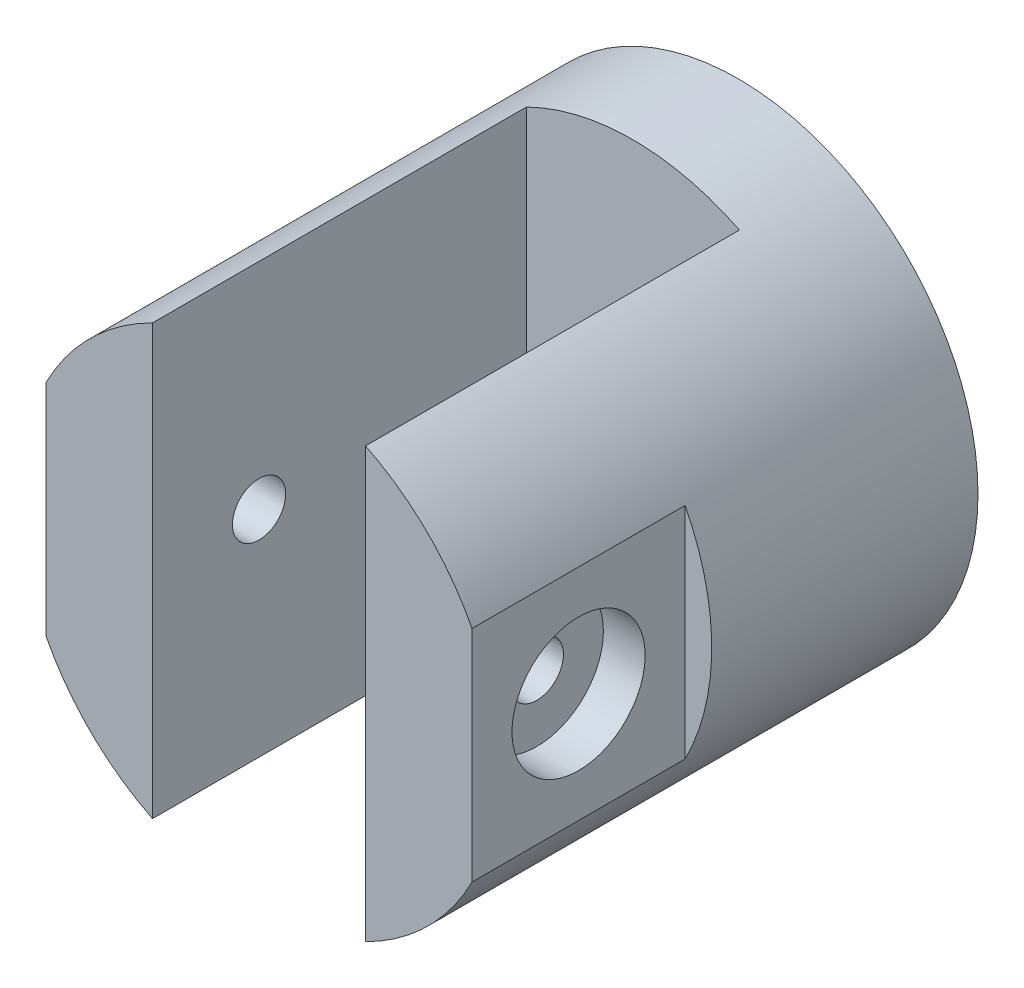
ISO-10303-21;
HEADER;
FILE_DESCRIPTION(('STEP AP214'),'2;1');
FILE_NAME('part.step','',(''),(''),'','','');
FILE_SCHEMA(('AUTOMOTIVE_DESIGN { 1 0 10303 214 1 1 1 1 }'));
ENDSEC;
DATA;
#1=APPLICATION_CONTEXT('core data for automotive mechanical design processes');
#2=APPLICATION_PROTOCOL_DEFINITION('international standard','automotive_design',2000,#1);
#3=PRODUCT_CONTEXT('',#1,'mechanical');
#4=PRODUCT('Part','Part','',(#3));
#5=PRODUCT_RELATED_PRODUCT_CATEGORY('part','',(#4));
#6=PRODUCT_DEFINITION_FORMATION('','',#4);
#7=PRODUCT_DEFINITION_CONTEXT('part definition',#1,'design');
#8=PRODUCT_DEFINITION('design','',#6,#7);
#9=PRODUCT_DEFINITION_SHAPE('','',#8);
#10=(LENGTH_UNIT() NAMED_UNIT(*) SI_UNIT(.MILLI.,.METRE.));
#11=(NAMED_UNIT(*) PLANE_ANGLE_UNIT() SI_UNIT($,.RADIAN.));
#12=(NAMED_UNIT(*) SI_UNIT($,.STERADIAN.) SOLID_ANGLE_UNIT());
#13=UNCERTAINTY_MEASURE_WITH_UNIT(LENGTH_MEASURE(1.E-05),#10,'distance_accuracy_value','');
#14=(GEOMETRIC_REPRESENTATION_CONTEXT(3) GLOBAL_UNCERTAINTY_ASSIGNED_CONTEXT((#13)) GLOBAL_UNIT_ASSIGNED_CONTEXT((#10,
#11,#12)) REPRESENTATION_CONTEXT('',''));
#15=CARTESIAN_POINT('',(0.,0.,0.));
#16=DIRECTION('',(0.,0.,1.));
#17=DIRECTION('',(1.,0.,0.));
#18=AXIS2_PLACEMENT_3D('',#15,#16,#17);
#19=CARTESIAN_POINT('',(-28.575,0.,44.45));
#20=DIRECTION('',(1.,0.,0.));
#21=DIRECTION('',(0.,0.,-1.));
#22=AXIS2_PLACEMENT_3D('',#19,#20,#21);
#23=CYLINDRICAL_SURFACE('',#22,3.175);
#24=CARTESIAN_POINT('',(-12.7,0.,44.45));
#25=DIRECTION('',(-1.,0.,0.));
#26=DIRECTION('',(0.,0.,1.));
#27=AXIS2_PLACEMENT_3D('',#24,#25,#26);
#28=CIRCLE('',#27,3.175);
#29=CARTESIAN_POINT('',(-12.7,0.,47.625));
#30=VERTEX_POINT('',#29);
#31=EDGE_CURVE('E139',#30,#30,#28,.T.);
#32=ORIENTED_EDGE('',*,*,#31,.F.);
#33=EDGE_LOOP('',(#32));
#34=FACE_BOUND('',#33,.T.);
#35=CARTESIAN_POINT('',(-20.4216,0.,44.45));
#36=DIRECTION('',(-1.,0.,0.));
#37=DIRECTION('',(0.,-1.,0.));
#38=AXIS2_PLACEMENT_3D('',#35,#36,#37);
#39=CIRCLE('',#38,3.175);
#40=CARTESIAN_POINT('',(-20.4216,-3.175,44.45));
#41=VERTEX_POINT('',#40);
#42=EDGE_CURVE('E43',#41,#41,#39,.F.);
#43=ORIENTED_EDGE('',*,*,#42,.F.);
#44=EDGE_LOOP('',(#43));
#45=FACE_BOUND('',#44,.T.);
#46=ADVANCED_FACE('F39',(#34,#45),#23,.F.);
#47=CARTESIAN_POINT('',(0.,0.,57.15));
#48=DIRECTION('',(0.,0.,-1.));
#49=DIRECTION('',(-1.,0.,0.));
#50=AXIS2_PLACEMENT_3D('',#47,#48,#49);
#51=CYLINDRICAL_SURFACE('',#50,28.575);
#52=CARTESIAN_POINT('',(0.,0.,0.));
#53=DIRECTION('',(0.,0.,1.));
#54=DIRECTION('',(1.,0.,0.));
#55=AXIS2_PLACEMENT_3D('',#52,#53,#54);
#56=CIRCLE('',#55,28.575);
#57=CARTESIAN_POINT('',(28.575,0.,0.));
#58=VERTEX_POINT('',#57);
#59=EDGE_CURVE('E185',#58,#58,#56,.T.);
#60=ORIENTED_EDGE('',*,*,#59,.T.);
#61=EDGE_LOOP('',(#60));
#62=FACE_BOUND('',#61,.T.);
#63=DIRECTION('',(0.,0.,-1.));
#64=VECTOR('',#63,1.);
#65=CARTESIAN_POINT('',(-25.4,13.0908603613361,200.727129565702));
#66=LINE('',#65,#64);
#67=CARTESIAN_POINT('',(-25.4,13.0908603613361,57.15));
#68=VERTEX_POINT('',#67);
#69=CARTESIAN_POINT('',(-25.4,13.0908603613361,31.75));
#70=VERTEX_POINT('',#69);
#71=EDGE_CURVE('E111',#68,#70,#66,.T.);
#72=ORIENTED_EDGE('',*,*,#71,.F.);
#73=CARTESIAN_POINT('',(0.,0.,57.15));
#74=DIRECTION('',(0.,0.,1.));
#75=DIRECTION('',(1.,0.,0.));
#76=AXIS2_PLACEMENT_3D('',#73,#74,#75);
#77=CIRCLE('',#76,28.575);
#78=CARTESIAN_POINT('',(-12.7,25.5976683508479,57.15));
#79=VERTEX_POINT('',#78);
#80=EDGE_CURVE('E192',#79,#68,#77,.T.);
#81=ORIENTED_EDGE('',*,*,#80,.F.);
#82=DIRECTION('',(0.,0.,-1.));
#83=VECTOR('',#82,1.);
#84=CARTESIAN_POINT('',(-12.7,25.5976683508479,57.15));
#85=LINE('',#84,#83);
#86=CARTESIAN_POINT('',(-12.7,25.5976683508479,12.573));
#87=VERTEX_POINT('',#86);
#88=EDGE_CURVE('E176',#79,#87,#85,.T.);
#89=ORIENTED_EDGE('',*,*,#88,.T.);
#90=CARTESIAN_POINT('',(0.,0.,12.573));
#91=DIRECTION('',(0.,0.,-1.));
#92=DIRECTION('',(-1.,0.,0.));
#93=AXIS2_PLACEMENT_3D('',#90,#91,#92);
#94=CIRCLE('',#93,28.575);
#95=CARTESIAN_POINT('',(12.7,25.5976683508479,12.573));
#96=VERTEX_POINT('',#95);
#97=EDGE_CURVE('E208',#87,#96,#94,.T.);
#98=ORIENTED_EDGE('',*,*,#97,.T.);
#99=DIRECTION('',(0.,0.,-1.));
#100=VECTOR('',#99,1.);
#101=CARTESIAN_POINT('',(12.7,25.5976683508479,57.15));
#102=LINE('',#101,#100);
#103=CARTESIAN_POINT('',(12.7,25.5976683508479,57.15));
#104=VERTEX_POINT('',#103);
#105=EDGE_CURVE('E179',#96,#104,#102,.F.);
#106=ORIENTED_EDGE('',*,*,#105,.T.);
#107=CARTESIAN_POINT('',(25.4,13.0908603613361,57.15));
#108=VERTEX_POINT('',#107);
#109=EDGE_CURVE('E191',#108,#104,#77,.T.);
#110=ORIENTED_EDGE('',*,*,#109,.F.);
#111=DIRECTION('',(0.,0.,-1.));
#112=VECTOR('',#111,1.);
#113=CARTESIAN_POINT('',(25.4,13.0908603613361,57.15));
#114=LINE('',#113,#112);
#115=CARTESIAN_POINT('',(25.4,13.0908603613361,31.75));
#116=VERTEX_POINT('',#115);
#117=EDGE_CURVE('E49',#116,#108,#114,.F.);
#118=ORIENTED_EDGE('',*,*,#117,.F.);
#119=CARTESIAN_POINT('',(0.,0.,31.75));
#120=DIRECTION('',(0.,0.,1.));
#121=DIRECTION('',(1.,0.,0.));
#122=AXIS2_PLACEMENT_3D('',#119,#120,#121);
#123=CIRCLE('',#122,28.575);
#124=CARTESIAN_POINT('',(25.4,-13.0908603613361,31.75));
#125=VERTEX_POINT('',#124);
#126=EDGE_CURVE('E150',#125,#116,#123,.T.);
#127=ORIENTED_EDGE('',*,*,#126,.F.);
#128=DIRECTION('',(0.,0.,-1.));
#129=VECTOR('',#128,1.);
#130=CARTESIAN_POINT('',(25.4,-13.0908603613361,57.15));
#131=LINE('',#130,#129);
#132=CARTESIAN_POINT('',(25.4,-13.0908603613361,57.15));
#133=VERTEX_POINT('',#132);
#134=EDGE_CURVE('E12',#133,#125,#131,.T.);
#135=ORIENTED_EDGE('',*,*,#134,.F.);
#136=CARTESIAN_POINT('',(12.7,-25.5976683508479,57.15));
#137=VERTEX_POINT('',#136);
#138=EDGE_CURVE('E186',#137,#133,#77,.T.);
#139=ORIENTED_EDGE('',*,*,#138,.F.);
#140=DIRECTION('',(0.,0.,-1.));
#141=VECTOR('',#140,1.);
#142=CARTESIAN_POINT('',(12.7,-25.5976683508479,57.15));
#143=LINE('',#142,#141);
#144=CARTESIAN_POINT('',(12.7,-25.5976683508479,12.573));
#145=VERTEX_POINT('',#144);
#146=EDGE_CURVE('E182',#137,#145,#143,.T.);
#147=ORIENTED_EDGE('',*,*,#146,.T.);
#148=CARTESIAN_POINT('',(-12.7,-25.5976683508479,12.573));
#149=VERTEX_POINT('',#148);
#150=EDGE_CURVE('E204',#145,#149,#94,.T.);
#151=ORIENTED_EDGE('',*,*,#150,.T.);
#152=DIRECTION('',(0.,0.,-1.));
#153=VECTOR('',#152,1.);
#154=CARTESIAN_POINT('',(-12.7,-25.5976683508479,57.15));
#155=LINE('',#154,#153);
#156=CARTESIAN_POINT('',(-12.7,-25.5976683508479,57.15));
#157=VERTEX_POINT('',#156);
#158=EDGE_CURVE('E169',#149,#157,#155,.F.);
#159=ORIENTED_EDGE('',*,*,#158,.T.);
#160=CARTESIAN_POINT('',(-25.4,-13.0908603613361,57.15));
#161=VERTEX_POINT('',#160);
#162=EDGE_CURVE('E190',#161,#157,#77,.T.);
#163=ORIENTED_EDGE('',*,*,#162,.F.);
#164=DIRECTION('',(0.,0.,-1.));
#165=VECTOR('',#164,1.);
#166=CARTESIAN_POINT('',(-25.4,-13.0908603613361,200.727129565702));
#167=LINE('',#166,#165);
#168=CARTESIAN_POINT('',(-25.4,-13.0908603613361,31.75));
#169=VERTEX_POINT('',#168);
#170=EDGE_CURVE('E57',#161,#169,#167,.T.);
#171=ORIENTED_EDGE('',*,*,#170,.T.);
#172=CARTESIAN_POINT('',(0.,0.,31.75));
#173=DIRECTION('',(0.,0.,1.));
#174=DIRECTION('',(1.,0.,0.));
#175=AXIS2_PLACEMENT_3D('',#172,#173,#174);
#176=CIRCLE('',#175,28.575);
#177=EDGE_CURVE('E109',#70,#169,#176,.T.);
#178=ORIENTED_EDGE('',*,*,#177,.F.);
#179=EDGE_LOOP('',(#72,#81,#89,#98,#106,#110,#118,#127,#135,#139,#147,#151,#159,#163,#171,#178));
#180=FACE_BOUND('',#179,.T.);
#181=ADVANCED_FACE('F41',(#62,#180),#51,.T.);
#182=CARTESIAN_POINT('',(0.,0.,57.15));
#183=DIRECTION('',(0.,0.,1.));
#184=DIRECTION('',(1.,0.,0.));
#185=AXIS2_PLACEMENT_3D('',#182,#183,#184);
#186=PLANE('',#185);
#187=ORIENTED_EDGE('',*,*,#80,.T.);
#188=DIRECTION('',(0.,1.,0.));
#189=VECTOR('',#188,1.);
#190=CARTESIAN_POINT('',(-25.4,-13.0908603613361,57.15));
#191=LINE('',#190,#189);
#192=EDGE_CURVE('E115',#161,#68,#191,.T.);
#193=ORIENTED_EDGE('',*,*,#192,.F.);
#194=ORIENTED_EDGE('',*,*,#162,.T.);
#195=DIRECTION('',(0.,-1.,0.));
#196=VECTOR('',#195,1.);
#197=CARTESIAN_POINT('',(-12.7,0.,57.15));
#198=LINE('',#197,#196);
#199=EDGE_CURVE('E196',#79,#157,#198,.T.);
#200=ORIENTED_EDGE('',*,*,#199,.F.);
#201=EDGE_LOOP('',(#187,#193,#194,#200));
#202=FACE_BOUND('',#201,.T.);
#203=ADVANCED_FACE('F219',(#202),#186,.T.);
#204=CARTESIAN_POINT('',(12.7,0.,44.45));
#205=DIRECTION('',(1.,0.,0.));
#206=DIRECTION('',(0.,0.,-1.));
#207=AXIS2_PLACEMENT_3D('',#204,#205,#206);
#208=CIRCLE('',#207,3.175);
#209=CARTESIAN_POINT('',(12.7,0.,41.275));
#210=VERTEX_POINT('',#209);
#211=EDGE_CURVE('E143',#210,#210,#208,.T.);
#212=ORIENTED_EDGE('',*,*,#211,.F.);
#213=EDGE_LOOP('',(#212));
#214=FACE_BOUND('',#213,.T.);
#215=CARTESIAN_POINT('',(20.4216,0.,44.45));
#216=DIRECTION('',(1.,0.,0.));
#217=DIRECTION('',(0.,0.,-1.));
#218=AXIS2_PLACEMENT_3D('',#215,#216,#217);
#219=CIRCLE('',#218,3.175);
#220=CARTESIAN_POINT('',(20.4216,0.,41.275));
#221=VERTEX_POINT('',#220);
#222=EDGE_CURVE('E134',#221,#221,#219,.F.);
#223=ORIENTED_EDGE('',*,*,#222,.F.);
#224=EDGE_LOOP('',(#223));
#225=FACE_BOUND('',#224,.T.);
#226=ADVANCED_FACE('F216',(#214,#225),#23,.F.);
#227=ORIENTED_EDGE('',*,*,#138,.T.);
#228=DIRECTION('',(0.,1.,0.));
#229=VECTOR('',#228,1.);
#230=CARTESIAN_POINT('',(25.4,-25.5976683508479,57.15));
#231=LINE('',#230,#229);
#232=EDGE_CURVE('E147',#133,#108,#231,.T.);
#233=ORIENTED_EDGE('',*,*,#232,.T.);
#234=ORIENTED_EDGE('',*,*,#109,.T.);
#235=DIRECTION('',(0.,1.,0.));
#236=VECTOR('',#235,1.);
#237=CARTESIAN_POINT('',(12.7,0.,57.15));
#238=LINE('',#237,#236);
#239=EDGE_CURVE('E200',#137,#104,#238,.T.);
#240=ORIENTED_EDGE('',*,*,#239,.F.);
#241=EDGE_LOOP('',(#227,#233,#234,#240));
#242=FACE_BOUND('',#241,.T.);
#243=ADVANCED_FACE('F218',(#242),#186,.T.);
#244=CARTESIAN_POINT('',(0.,0.,0.));
#245=DIRECTION('',(0.,0.,1.));
#246=DIRECTION('',(1.,0.,0.));
#247=AXIS2_PLACEMENT_3D('',#244,#245,#246);
#248=PLANE('',#247);
#249=CARTESIAN_POINT('',(0.,0.,0.));
#250=DIRECTION('',(0.,0.,1.));
#251=DIRECTION('',(1.,0.,0.));
#252=AXIS2_PLACEMENT_3D('',#249,#250,#251);
#253=CIRCLE('',#252,7.9375);
#254=CARTESIAN_POINT('',(7.9375,0.,0.));
#255=VERTEX_POINT('',#254);
#256=EDGE_CURVE('E157',#255,#255,#253,.T.);
#257=ORIENTED_EDGE('',*,*,#256,.T.);
#258=EDGE_LOOP('',(#257));
#259=FACE_BOUND('',#258,.T.);
#260=ORIENTED_EDGE('',*,*,#59,.F.);
#261=EDGE_LOOP('',(#260));
#262=FACE_BOUND('',#261,.T.);
#263=ADVANCED_FACE('F227',(#259,#262),#248,.F.);
#264=CARTESIAN_POINT('',(-12.7,-50.8,12.573));
#265=DIRECTION('',(0.,0.,-1.));
#266=DIRECTION('',(-1.,0.,0.));
#267=AXIS2_PLACEMENT_3D('',#264,#265,#266);
#268=PLANE('',#267);
#269=CARTESIAN_POINT('',(0.,0.,12.573));
#270=DIRECTION('',(0.,0.,1.));
#271=DIRECTION('',(1.,0.,0.));
#272=AXIS2_PLACEMENT_3D('',#269,#270,#271);
#273=CIRCLE('',#272,7.9375);
#274=CARTESIAN_POINT('',(7.9375,0.,12.573));
#275=VERTEX_POINT('',#274);
#276=EDGE_CURVE('E156',#275,#275,#273,.T.);
#277=ORIENTED_EDGE('',*,*,#276,.F.);
#278=EDGE_LOOP('',(#277));
#279=FACE_BOUND('',#278,.T.);
#280=DIRECTION('',(0.,1.,0.));
#281=VECTOR('',#280,1.);
#282=CARTESIAN_POINT('',(-12.7,-50.8,12.573));
#283=LINE('',#282,#281);
#284=EDGE_CURVE('E165',#149,#87,#283,.T.);
#285=ORIENTED_EDGE('',*,*,#284,.F.);
#286=ORIENTED_EDGE('',*,*,#150,.F.);
#287=DIRECTION('',(0.,1.,0.));
#288=VECTOR('',#287,1.);
#289=CARTESIAN_POINT('',(12.7,-50.8,12.573));
#290=LINE('',#289,#288);
#291=EDGE_CURVE('E161',#145,#96,#290,.T.);
#292=ORIENTED_EDGE('',*,*,#291,.T.);
#293=ORIENTED_EDGE('',*,*,#97,.F.);
#294=EDGE_LOOP('',(#285,#286,#292,#293));
#295=FACE_BOUND('',#294,.T.);
#296=ADVANCED_FACE('F290',(#279,#295),#268,.F.);
#297=CARTESIAN_POINT('',(12.7,-50.8,12.573));
#298=DIRECTION('',(1.,0.,0.));
#299=DIRECTION('',(0.,0.,-1.));
#300=AXIS2_PLACEMENT_3D('',#297,#298,#299);
#301=PLANE('',#300);
#302=ORIENTED_EDGE('',*,*,#211,.T.);
#303=EDGE_LOOP('',(#302));
#304=FACE_BOUND('',#303,.T.);
#305=ORIENTED_EDGE('',*,*,#239,.T.);
#306=ORIENTED_EDGE('',*,*,#105,.F.);
#307=ORIENTED_EDGE('',*,*,#291,.F.);
#308=ORIENTED_EDGE('',*,*,#146,.F.);
#309=EDGE_LOOP('',(#305,#306,#307,#308));
#310=FACE_BOUND('',#309,.T.);
#311=ADVANCED_FACE('F293',(#304,#310),#301,.F.);
#312=CARTESIAN_POINT('',(-12.7,-50.8,12.573));
#313=DIRECTION('',(-1.,0.,0.));
#314=DIRECTION('',(0.,0.,1.));
#315=AXIS2_PLACEMENT_3D('',#312,#313,#314);
#316=PLANE('',#315);
#317=ORIENTED_EDGE('',*,*,#31,.T.);
#318=EDGE_LOOP('',(#317));
#319=FACE_BOUND('',#318,.T.);
#320=ORIENTED_EDGE('',*,*,#199,.T.);
#321=ORIENTED_EDGE('',*,*,#158,.F.);
#322=ORIENTED_EDGE('',*,*,#284,.T.);
#323=ORIENTED_EDGE('',*,*,#88,.F.);
#324=EDGE_LOOP('',(#320,#321,#322,#323));
#325=FACE_BOUND('',#324,.T.);
#326=ADVANCED_FACE('F300',(#319,#325),#316,.F.);
#327=CARTESIAN_POINT('',(0.,0.,0.));
#328=DIRECTION('',(0.,0.,1.));
#329=DIRECTION('',(1.,0.,0.));
#330=AXIS2_PLACEMENT_3D('',#327,#328,#329);
#331=CYLINDRICAL_SURFACE('',#330,7.9375);
#332=ORIENTED_EDGE('',*,*,#256,.F.);
#333=EDGE_LOOP('',(#332));
#334=FACE_BOUND('',#333,.T.);
#335=ORIENTED_EDGE('',*,*,#276,.T.);
#336=EDGE_LOOP('',(#335));
#337=FACE_BOUND('',#336,.T.);
#338=ADVANCED_FACE('F276',(#334,#337),#331,.F.);
#339=CARTESIAN_POINT('',(25.4,-25.5976683508479,31.75));
#340=DIRECTION('',(1.,0.,0.));
#341=DIRECTION('',(0.,0.,-1.));
#342=AXIS2_PLACEMENT_3D('',#339,#340,#341);
#343=PLANE('',#342);
#344=CARTESIAN_POINT('',(25.4,0.,44.45));
#345=DIRECTION('',(1.,0.,0.));
#346=DIRECTION('',(0.,0.,-1.));
#347=AXIS2_PLACEMENT_3D('',#344,#345,#346);
#348=CIRCLE('',#347,7.9375);
#349=CARTESIAN_POINT('',(25.4,0.,36.5125));
#350=VERTEX_POINT('',#349);
#351=EDGE_CURVE('E135',#350,#350,#348,.T.);
#352=ORIENTED_EDGE('',*,*,#351,.F.);
#353=EDGE_LOOP('',(#352));
#354=FACE_BOUND('',#353,.T.);
#355=ORIENTED_EDGE('',*,*,#134,.T.);
#356=DIRECTION('',(0.,1.,0.));
#357=VECTOR('',#356,1.);
#358=CARTESIAN_POINT('',(25.4,-25.5976683508479,31.75));
#359=LINE('',#358,#357);
#360=EDGE_CURVE('E64',#125,#116,#359,.T.);
#361=ORIENTED_EDGE('',*,*,#360,.T.);
#362=ORIENTED_EDGE('',*,*,#117,.T.);
#363=ORIENTED_EDGE('',*,*,#232,.F.);
#364=EDGE_LOOP('',(#355,#361,#362,#363));
#365=FACE_BOUND('',#364,.T.);
#366=ADVANCED_FACE('F275',(#354,#365),#343,.T.);
#367=CARTESIAN_POINT('',(0.,0.,31.75));
#368=DIRECTION('',(0.,0.,1.));
#369=DIRECTION('',(1.,0.,0.));
#370=AXIS2_PLACEMENT_3D('',#367,#368,#369);
#371=PLANE('',#370);
#372=ORIENTED_EDGE('',*,*,#126,.T.);
#373=ORIENTED_EDGE('',*,*,#360,.F.);
#374=EDGE_LOOP('',(#372,#373));
#375=FACE_BOUND('',#374,.T.);
#376=ADVANCED_FACE('F265',(#375),#371,.T.);
#377=CARTESIAN_POINT('',(20.4216,0.,44.45));
#378=DIRECTION('',(1.,0.,0.));
#379=DIRECTION('',(0.,0.,-1.));
#380=AXIS2_PLACEMENT_3D('',#377,#378,#379);
#381=PLANE('',#380);
#382=CARTESIAN_POINT('',(20.4216,0.,44.45));
#383=DIRECTION('',(1.,0.,0.));
#384=DIRECTION('',(0.,0.,-1.));
#385=AXIS2_PLACEMENT_3D('',#382,#383,#384);
#386=CIRCLE('',#385,7.9375);
#387=CARTESIAN_POINT('',(20.4216,0.,36.5125));
#388=VERTEX_POINT('',#387);
#389=EDGE_CURVE('E130',#388,#388,#386,.T.);
#390=ORIENTED_EDGE('',*,*,#389,.T.);
#391=EDGE_LOOP('',(#390));
#392=FACE_BOUND('',#391,.T.);
#393=ORIENTED_EDGE('',*,*,#222,.T.);
#394=EDGE_LOOP('',(#393));
#395=FACE_BOUND('',#394,.T.);
#396=ADVANCED_FACE('F214',(#392,#395),#381,.T.);
#397=CARTESIAN_POINT('',(20.4216,0.,44.45));
#398=DIRECTION('',(1.,0.,0.));
#399=DIRECTION('',(0.,0.,-1.));
#400=AXIS2_PLACEMENT_3D('',#397,#398,#399);
#401=CYLINDRICAL_SURFACE('',#400,7.9375);
#402=ORIENTED_EDGE('',*,*,#389,.F.);
#403=EDGE_LOOP('',(#402));
#404=FACE_BOUND('',#403,.T.);
#405=ORIENTED_EDGE('',*,*,#351,.T.);
#406=EDGE_LOOP('',(#405));
#407=FACE_BOUND('',#406,.T.);
#408=ADVANCED_FACE('F261',(#404,#407),#401,.F.);
#409=CARTESIAN_POINT('',(-25.4,-13.0908603613361,200.727129565702));
#410=DIRECTION('',(-1.,0.,0.));
#411=DIRECTION('',(0.,-1.,0.));
#412=AXIS2_PLACEMENT_3D('',#409,#410,#411);
#413=PLANE('',#412);
#414=CARTESIAN_POINT('',(-25.4,0.,44.45));
#415=DIRECTION('',(-1.,0.,0.));
#416=DIRECTION('',(0.,-1.,0.));
#417=AXIS2_PLACEMENT_3D('',#414,#415,#416);
#418=CIRCLE('',#417,7.9375);
#419=CARTESIAN_POINT('',(-25.4,-7.9375,44.45));
#420=VERTEX_POINT('',#419);
#421=EDGE_CURVE('E423',#420,#420,#418,.T.);
#422=ORIENTED_EDGE('',*,*,#421,.F.);
#423=EDGE_LOOP('',(#422));
#424=FACE_BOUND('',#423,.T.);
#425=ORIENTED_EDGE('',*,*,#170,.F.);
#426=ORIENTED_EDGE('',*,*,#192,.T.);
#427=ORIENTED_EDGE('',*,*,#71,.T.);
#428=DIRECTION('',(0.,1.,0.));
#429=VECTOR('',#428,1.);
#430=CARTESIAN_POINT('',(-25.4,-13.0908603613361,31.75));
#431=LINE('',#430,#429);
#432=EDGE_CURVE('E105',#169,#70,#431,.T.);
#433=ORIENTED_EDGE('',*,*,#432,.F.);
#434=EDGE_LOOP('',(#425,#426,#427,#433));
#435=FACE_BOUND('',#434,.T.);
#436=ADVANCED_FACE('F114',(#424,#435),#413,.T.);
#437=CARTESIAN_POINT('',(0.,0.,31.75));
#438=DIRECTION('',(0.,0.,1.));
#439=DIRECTION('',(1.,0.,0.));
#440=AXIS2_PLACEMENT_3D('',#437,#438,#439);
#441=PLANE('',#440);
#442=ORIENTED_EDGE('',*,*,#432,.T.);
#443=ORIENTED_EDGE('',*,*,#177,.T.);
#444=EDGE_LOOP('',(#442,#443));
#445=FACE_BOUND('',#444,.T.);
#446=ADVANCED_FACE('F107',(#445),#441,.T.);
#447=CARTESIAN_POINT('',(-20.4216,0.,44.45));
#448=DIRECTION('',(-1.,0.,0.));
#449=DIRECTION('',(0.,-1.,0.));
#450=AXIS2_PLACEMENT_3D('',#447,#448,#449);
#451=PLANE('',#450);
#452=CARTESIAN_POINT('',(-20.4216,0.,44.45));
#453=DIRECTION('',(-1.,0.,0.));
#454=DIRECTION('',(0.,-1.,0.));
#455=AXIS2_PLACEMENT_3D('',#452,#453,#454);
#456=CIRCLE('',#455,7.9375);
#457=CARTESIAN_POINT('',(-20.4216,-7.9375,44.45));
#458=VERTEX_POINT('',#457);
#459=EDGE_CURVE('E126',#458,#458,#456,.T.);
#460=ORIENTED_EDGE('',*,*,#459,.T.);
#461=EDGE_LOOP('',(#460));
#462=FACE_BOUND('',#461,.T.);
#463=ORIENTED_EDGE('',*,*,#42,.T.);
#464=EDGE_LOOP('',(#463));
#465=FACE_BOUND('',#464,.T.);
#466=ADVANCED_FACE('F247',(#462,#465),#451,.T.);
#467=CARTESIAN_POINT('',(-20.4216,0.,44.45));
#468=DIRECTION('',(-1.,0.,0.));
#469=DIRECTION('',(0.,-1.,0.));
#470=AXIS2_PLACEMENT_3D('',#467,#468,#469);
#471=CYLINDRICAL_SURFACE('',#470,7.9375);
#472=ORIENTED_EDGE('',*,*,#459,.F.);
#473=EDGE_LOOP('',(#472));
#474=FACE_BOUND('',#473,.T.);
#475=ORIENTED_EDGE('',*,*,#421,.T.);
#476=EDGE_LOOP('',(#475));
#477=FACE_BOUND('',#476,.T.);
#478=ADVANCED_FACE('F249',(#474,#477),#471,.F.);
#479=CLOSED_SHELL('',(#46,#181,#203,#226,#243,#263,#296,#311,#326,#338,#366,#376,#396,#408,#436,
#446,#466,#478));
#480=MANIFOLD_SOLID_BREP('B2',#479);
#481=ADVANCED_BREP_SHAPE_REPRESENTATION('',(#18,#480),#14);
#482=SHAPE_DEFINITION_REPRESENTATION(#9,#481);
ENDSEC;
END-ISO-10303-21;
